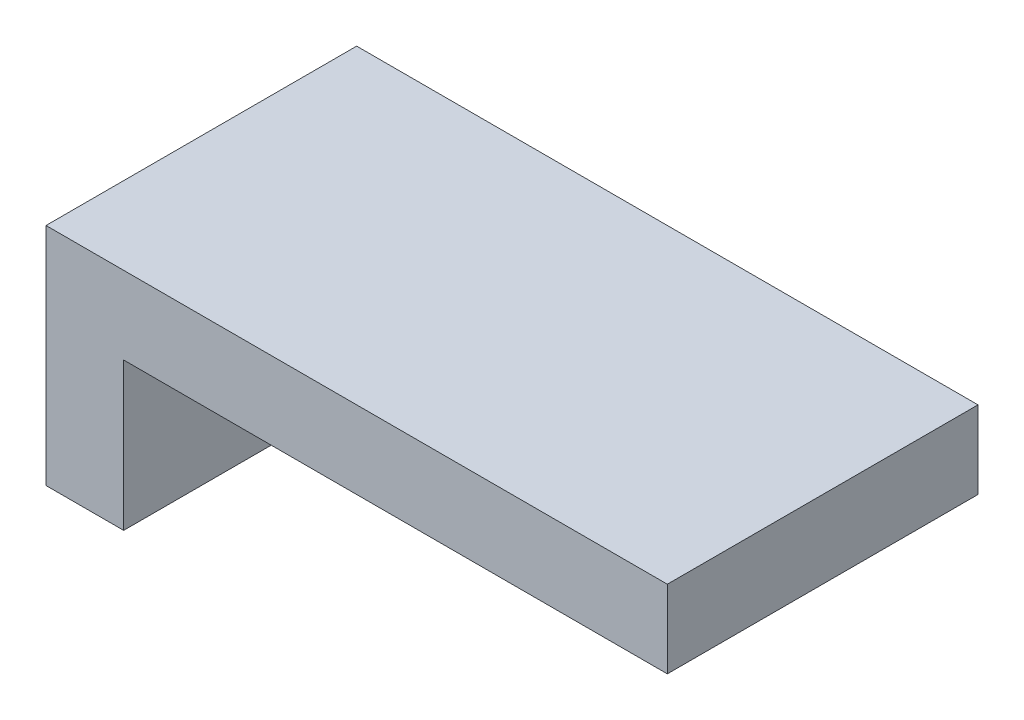
ISO-10303-21;
HEADER;
FILE_DESCRIPTION(('STEP AP214'),'2;1');
FILE_NAME('part.step','',(''),(''),'','','');
FILE_SCHEMA(('AUTOMOTIVE_DESIGN { 1 0 10303 214 1 1 1 1 }'));
ENDSEC;
DATA;
#1=APPLICATION_CONTEXT('core data for automotive mechanical design processes');
#2=APPLICATION_PROTOCOL_DEFINITION('international standard','automotive_design',2000,#1);
#3=PRODUCT_CONTEXT('',#1,'mechanical');
#4=PRODUCT('Part','Part','',(#3));
#5=PRODUCT_RELATED_PRODUCT_CATEGORY('part','',(#4));
#6=PRODUCT_DEFINITION_FORMATION('','',#4);
#7=PRODUCT_DEFINITION_CONTEXT('part definition',#1,'design');
#8=PRODUCT_DEFINITION('design','',#6,#7);
#9=PRODUCT_DEFINITION_SHAPE('','',#8);
#10=(LENGTH_UNIT() NAMED_UNIT(*) SI_UNIT(.MILLI.,.METRE.));
#11=(NAMED_UNIT(*) PLANE_ANGLE_UNIT() SI_UNIT($,.RADIAN.));
#12=(NAMED_UNIT(*) SI_UNIT($,.STERADIAN.) SOLID_ANGLE_UNIT());
#13=UNCERTAINTY_MEASURE_WITH_UNIT(LENGTH_MEASURE(1.E-05),#10,'distance_accuracy_value','');
#14=(GEOMETRIC_REPRESENTATION_CONTEXT(3) GLOBAL_UNCERTAINTY_ASSIGNED_CONTEXT((#13)) GLOBAL_UNIT_ASSIGNED_CONTEXT((#10,
#11,#12)) REPRESENTATION_CONTEXT('',''));
#15=CARTESIAN_POINT('',(0.,0.,0.));
#16=DIRECTION('',(0.,0.,1.));
#17=DIRECTION('',(1.,0.,0.));
#18=AXIS2_PLACEMENT_3D('',#15,#16,#17);
#19=CARTESIAN_POINT('',(0.,1.9,0.));
#20=DIRECTION('',(-1.,0.,0.));
#21=DIRECTION('',(0.,0.,1.));
#22=AXIS2_PLACEMENT_3D('',#19,#20,#21);
#23=PLANE('',#22);
#24=DIRECTION('',(0.,0.,-1.));
#25=VECTOR('',#24,1.);
#26=CARTESIAN_POINT('',(0.,1.9,-4.));
#27=LINE('',#26,#25);
#28=CARTESIAN_POINT('',(0.,1.9,0.));
#29=VERTEX_POINT('',#28);
#30=CARTESIAN_POINT('',(0.,1.9,-4.));
#31=VERTEX_POINT('',#30);
#32=EDGE_CURVE('E48',#29,#31,#27,.T.);
#33=ORIENTED_EDGE('',*,*,#32,.F.);
#34=DIRECTION('',(0.,-1.,0.));
#35=VECTOR('',#34,1.);
#36=CARTESIAN_POINT('',(0.,1.9,0.));
#37=LINE('',#36,#35);
#38=CARTESIAN_POINT('',(0.,0.,0.));
#39=VERTEX_POINT('',#38);
#40=EDGE_CURVE('E11',#29,#39,#37,.T.);
#41=ORIENTED_EDGE('',*,*,#40,.T.);
#42=DIRECTION('',(0.,0.,-1.));
#43=VECTOR('',#42,1.);
#44=CARTESIAN_POINT('',(0.,0.,0.));
#45=LINE('',#44,#43);
#46=CARTESIAN_POINT('',(0.,0.,-4.));
#47=VERTEX_POINT('',#46);
#48=EDGE_CURVE('E130',#39,#47,#45,.T.);
#49=ORIENTED_EDGE('',*,*,#48,.T.);
#50=DIRECTION('',(0.,-1.,0.));
#51=VECTOR('',#50,1.);
#52=CARTESIAN_POINT('',(0.,1.9,-4.));
#53=LINE('',#52,#51);
#54=EDGE_CURVE('E41',#31,#47,#53,.T.);
#55=ORIENTED_EDGE('',*,*,#54,.F.);
#56=EDGE_LOOP('',(#33,#41,#49,#55));
#57=FACE_BOUND('',#56,.T.);
#58=ADVANCED_FACE('F32',(#57),#23,.F.);
#59=CARTESIAN_POINT('',(0.,1.9,0.));
#60=DIRECTION('',(0.,0.,1.));
#61=DIRECTION('',(1.,0.,0.));
#62=AXIS2_PLACEMENT_3D('',#59,#60,#61);
#63=PLANE('',#62);
#64=DIRECTION('',(-1.,0.,0.));
#65=VECTOR('',#64,1.);
#66=CARTESIAN_POINT('',(0.,0.,0.));
#67=LINE('',#66,#65);
#68=CARTESIAN_POINT('',(-1.,0.,0.));
#69=VERTEX_POINT('',#68);
#70=EDGE_CURVE('E95',#39,#69,#67,.T.);
#71=ORIENTED_EDGE('',*,*,#70,.F.);
#72=ORIENTED_EDGE('',*,*,#40,.F.);
#73=DIRECTION('',(-1.,0.,0.));
#74=VECTOR('',#73,1.);
#75=CARTESIAN_POINT('',(7.,1.9,0.));
#76=LINE('',#75,#74);
#77=CARTESIAN_POINT('',(7.,1.9,0.));
#78=VERTEX_POINT('',#77);
#79=EDGE_CURVE('E117',#78,#29,#76,.T.);
#80=ORIENTED_EDGE('',*,*,#79,.F.);
#81=DIRECTION('',(0.,-1.,0.));
#82=VECTOR('',#81,1.);
#83=CARTESIAN_POINT('',(7.,2.9,0.));
#84=LINE('',#83,#82);
#85=CARTESIAN_POINT('',(7.,2.9,0.));
#86=VERTEX_POINT('',#85);
#87=EDGE_CURVE('E104',#86,#78,#84,.T.);
#88=ORIENTED_EDGE('',*,*,#87,.F.);
#89=DIRECTION('',(1.,0.,0.));
#90=VECTOR('',#89,1.);
#91=CARTESIAN_POINT('',(-1.,2.9,0.));
#92=LINE('',#91,#90);
#93=CARTESIAN_POINT('',(-1.,2.9,0.));
#94=VERTEX_POINT('',#93);
#95=EDGE_CURVE('E96',#94,#86,#92,.T.);
#96=ORIENTED_EDGE('',*,*,#95,.F.);
#97=DIRECTION('',(0.,-1.,0.));
#98=VECTOR('',#97,1.);
#99=CARTESIAN_POINT('',(-1.,1.9,0.));
#100=LINE('',#99,#98);
#101=EDGE_CURVE('E36',#94,#69,#100,.T.);
#102=ORIENTED_EDGE('',*,*,#101,.T.);
#103=EDGE_LOOP('',(#71,#72,#80,#88,#96,#102));
#104=FACE_BOUND('',#103,.T.);
#105=ADVANCED_FACE('F34',(#104),#63,.T.);
#106=CARTESIAN_POINT('',(0.,1.9,-4.));
#107=DIRECTION('',(0.,0.,1.));
#108=DIRECTION('',(1.,0.,0.));
#109=AXIS2_PLACEMENT_3D('',#106,#107,#108);
#110=PLANE('',#109);
#111=DIRECTION('',(-1.,0.,0.));
#112=VECTOR('',#111,1.);
#113=CARTESIAN_POINT('',(0.,0.,-4.));
#114=LINE('',#113,#112);
#115=CARTESIAN_POINT('',(-1.,0.,-4.));
#116=VERTEX_POINT('',#115);
#117=EDGE_CURVE('E128',#47,#116,#114,.T.);
#118=ORIENTED_EDGE('',*,*,#117,.T.);
#119=DIRECTION('',(0.,-1.,0.));
#120=VECTOR('',#119,1.);
#121=CARTESIAN_POINT('',(-1.,1.9,-4.));
#122=LINE('',#121,#120);
#123=CARTESIAN_POINT('',(-1.,2.9,-4.));
#124=VERTEX_POINT('',#123);
#125=EDGE_CURVE('E91',#124,#116,#122,.T.);
#126=ORIENTED_EDGE('',*,*,#125,.F.);
#127=DIRECTION('',(-1.,0.,0.));
#128=VECTOR('',#127,1.);
#129=CARTESIAN_POINT('',(-1.,2.9,-4.));
#130=LINE('',#129,#128);
#131=CARTESIAN_POINT('',(7.,2.9,-4.));
#132=VERTEX_POINT('',#131);
#133=EDGE_CURVE('E84',#132,#124,#130,.T.);
#134=ORIENTED_EDGE('',*,*,#133,.F.);
#135=DIRECTION('',(0.,1.,0.));
#136=VECTOR('',#135,1.);
#137=CARTESIAN_POINT('',(7.,2.9,-4.));
#138=LINE('',#137,#136);
#139=CARTESIAN_POINT('',(7.,1.9,-4.));
#140=VERTEX_POINT('',#139);
#141=EDGE_CURVE('E90',#140,#132,#138,.T.);
#142=ORIENTED_EDGE('',*,*,#141,.F.);
#143=DIRECTION('',(-1.,0.,0.));
#144=VECTOR('',#143,1.);
#145=CARTESIAN_POINT('',(7.,1.9,-4.));
#146=LINE('',#145,#144);
#147=EDGE_CURVE('E114',#140,#31,#146,.T.);
#148=ORIENTED_EDGE('',*,*,#147,.T.);
#149=ORIENTED_EDGE('',*,*,#54,.T.);
#150=EDGE_LOOP('',(#118,#126,#134,#142,#148,#149));
#151=FACE_BOUND('',#150,.T.);
#152=ADVANCED_FACE('F87',(#151),#110,.F.);
#153=CARTESIAN_POINT('',(-1.,1.9,0.));
#154=DIRECTION('',(-1.,0.,0.));
#155=DIRECTION('',(0.,0.,1.));
#156=AXIS2_PLACEMENT_3D('',#153,#154,#155);
#157=PLANE('',#156);
#158=DIRECTION('',(0.,0.,-1.));
#159=VECTOR('',#158,1.);
#160=CARTESIAN_POINT('',(-1.,0.,0.));
#161=LINE('',#160,#159);
#162=EDGE_CURVE('E125',#69,#116,#161,.T.);
#163=ORIENTED_EDGE('',*,*,#162,.F.);
#164=ORIENTED_EDGE('',*,*,#101,.F.);
#165=DIRECTION('',(0.,0.,1.));
#166=VECTOR('',#165,1.);
#167=CARTESIAN_POINT('',(-1.,2.9,-4.));
#168=LINE('',#167,#166);
#169=EDGE_CURVE('E120',#124,#94,#168,.T.);
#170=ORIENTED_EDGE('',*,*,#169,.F.);
#171=ORIENTED_EDGE('',*,*,#125,.T.);
#172=EDGE_LOOP('',(#163,#164,#170,#171));
#173=FACE_BOUND('',#172,.T.);
#174=ADVANCED_FACE('F136',(#173),#157,.T.);
#175=CARTESIAN_POINT('',(0.,0.,0.));
#176=DIRECTION('',(0.,-1.,0.));
#177=DIRECTION('',(0.,0.,-1.));
#178=AXIS2_PLACEMENT_3D('',#175,#176,#177);
#179=PLANE('',#178);
#180=ORIENTED_EDGE('',*,*,#70,.T.);
#181=ORIENTED_EDGE('',*,*,#162,.T.);
#182=ORIENTED_EDGE('',*,*,#117,.F.);
#183=ORIENTED_EDGE('',*,*,#48,.F.);
#184=EDGE_LOOP('',(#180,#181,#182,#183));
#185=FACE_BOUND('',#184,.T.);
#186=ADVANCED_FACE('F139',(#185),#179,.T.);
#187=CARTESIAN_POINT('',(0.,2.9,0.));
#188=DIRECTION('',(0.,1.,0.));
#189=DIRECTION('',(0.,0.,1.));
#190=AXIS2_PLACEMENT_3D('',#187,#188,#189);
#191=PLANE('',#190);
#192=ORIENTED_EDGE('',*,*,#169,.T.);
#193=ORIENTED_EDGE('',*,*,#95,.T.);
#194=DIRECTION('',(0.,0.,1.));
#195=VECTOR('',#194,1.);
#196=CARTESIAN_POINT('',(7.,2.9,-4.));
#197=LINE('',#196,#195);
#198=EDGE_CURVE('E99',#132,#86,#197,.T.);
#199=ORIENTED_EDGE('',*,*,#198,.F.);
#200=ORIENTED_EDGE('',*,*,#133,.T.);
#201=EDGE_LOOP('',(#192,#193,#199,#200));
#202=FACE_BOUND('',#201,.T.);
#203=ADVANCED_FACE('F100',(#202),#191,.T.);
#204=CARTESIAN_POINT('',(7.,1.9,-4.));
#205=DIRECTION('',(0.,1.,0.));
#206=DIRECTION('',(0.,0.,1.));
#207=AXIS2_PLACEMENT_3D('',#204,#205,#206);
#208=PLANE('',#207);
#209=ORIENTED_EDGE('',*,*,#32,.T.);
#210=ORIENTED_EDGE('',*,*,#147,.F.);
#211=DIRECTION('',(0.,0.,-1.));
#212=VECTOR('',#211,1.);
#213=CARTESIAN_POINT('',(7.,1.9,-4.));
#214=LINE('',#213,#212);
#215=EDGE_CURVE('E108',#78,#140,#214,.T.);
#216=ORIENTED_EDGE('',*,*,#215,.F.);
#217=ORIENTED_EDGE('',*,*,#79,.T.);
#218=EDGE_LOOP('',(#209,#210,#216,#217));
#219=FACE_BOUND('',#218,.T.);
#220=ADVANCED_FACE('F141',(#219),#208,.F.);
#221=CARTESIAN_POINT('',(7.,0.,0.));
#222=DIRECTION('',(-1.,0.,0.));
#223=DIRECTION('',(0.,0.,1.));
#224=AXIS2_PLACEMENT_3D('',#221,#222,#223);
#225=PLANE('',#224);
#226=ORIENTED_EDGE('',*,*,#141,.T.);
#227=ORIENTED_EDGE('',*,*,#198,.T.);
#228=ORIENTED_EDGE('',*,*,#87,.T.);
#229=ORIENTED_EDGE('',*,*,#215,.T.);
#230=EDGE_LOOP('',(#226,#227,#228,#229));
#231=FACE_BOUND('',#230,.T.);
#232=ADVANCED_FACE('F106',(#231),#225,.F.);
#233=CLOSED_SHELL('',(#58,#105,#152,#174,#186,#203,#220,#232));
#234=MANIFOLD_SOLID_BREP('B2',#233);
#235=ADVANCED_BREP_SHAPE_REPRESENTATION('',(#18,#234),#14);
#236=SHAPE_DEFINITION_REPRESENTATION(#9,#235);
ENDSEC;
END-ISO-10303-21;
